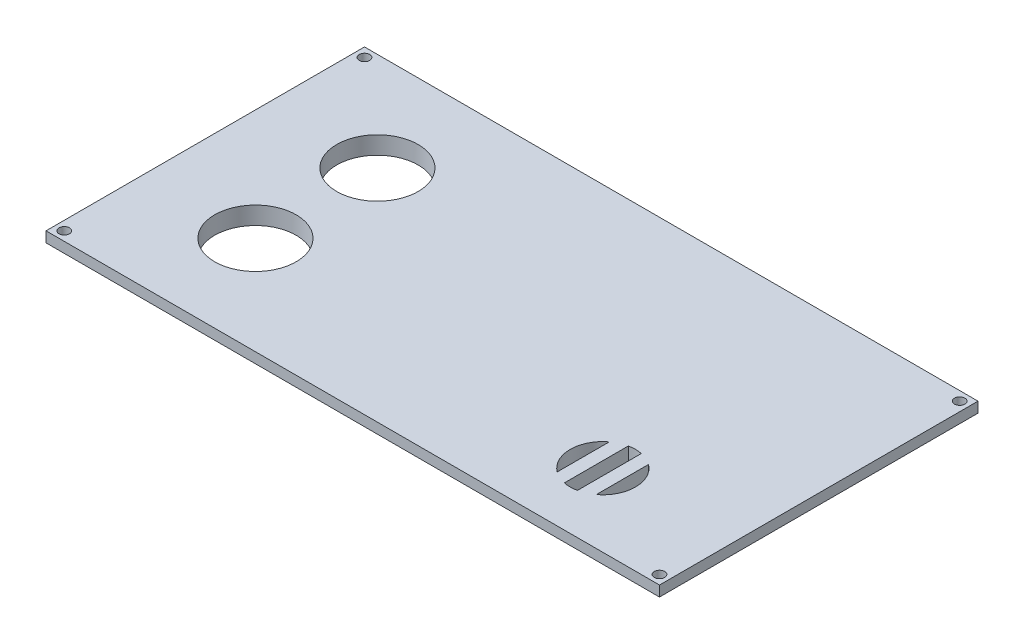
ISO-10303-21;
HEADER;
FILE_DESCRIPTION(('STEP AP214'),'2;1');
FILE_NAME('part.step','',(''),(''),'','','');
FILE_SCHEMA(('AUTOMOTIVE_DESIGN { 1 0 10303 214 1 1 1 1 }'));
ENDSEC;
DATA;
#1=APPLICATION_CONTEXT('core data for automotive mechanical design processes');
#2=APPLICATION_PROTOCOL_DEFINITION('international standard','automotive_design',2000,#1);
#3=PRODUCT_CONTEXT('',#1,'mechanical');
#4=PRODUCT('Part','Part','',(#3));
#5=PRODUCT_RELATED_PRODUCT_CATEGORY('part','',(#4));
#6=PRODUCT_DEFINITION_FORMATION('','',#4);
#7=PRODUCT_DEFINITION_CONTEXT('part definition',#1,'design');
#8=PRODUCT_DEFINITION('design','',#6,#7);
#9=PRODUCT_DEFINITION_SHAPE('','',#8);
#10=(LENGTH_UNIT() NAMED_UNIT(*) SI_UNIT(.MILLI.,.METRE.));
#11=(NAMED_UNIT(*) PLANE_ANGLE_UNIT() SI_UNIT($,.RADIAN.));
#12=(NAMED_UNIT(*) SI_UNIT($,.STERADIAN.) SOLID_ANGLE_UNIT());
#13=UNCERTAINTY_MEASURE_WITH_UNIT(LENGTH_MEASURE(1.E-05),#10,'distance_accuracy_value','');
#14=(GEOMETRIC_REPRESENTATION_CONTEXT(3) GLOBAL_UNCERTAINTY_ASSIGNED_CONTEXT((#13)) GLOBAL_UNIT_ASSIGNED_CONTEXT((#10,
#11,#12)) REPRESENTATION_CONTEXT('',''));
#15=CARTESIAN_POINT('',(0.,0.,0.));
#16=DIRECTION('',(0.,0.,1.));
#17=DIRECTION('',(1.,0.,0.));
#18=AXIS2_PLACEMENT_3D('',#15,#16,#17);
#19=CARTESIAN_POINT('',(0.,0.,0.));
#20=DIRECTION('',(0.,1.,0.));
#21=DIRECTION('',(0.,0.,1.));
#22=AXIS2_PLACEMENT_3D('',#19,#20,#21);
#23=PLANE('',#22);
#24=CARTESIAN_POINT('',(54.6975267144959,0.,16.55));
#25=DIRECTION('',(0.,1.,0.));
#26=DIRECTION('',(0.,0.,1.));
#27=AXIS2_PLACEMENT_3D('',#24,#25,#26);
#28=CIRCLE('',#27,6.25);
#29=CARTESIAN_POINT('',(53.4475267144959,0.,22.673724356958));
#30=VERTEX_POINT('',#29);
#31=CARTESIAN_POINT('',(55.9475267144959,0.,22.673724356958));
#32=VERTEX_POINT('',#31);
#33=EDGE_CURVE('E59',#30,#32,#28,.T.);
#34=ORIENTED_EDGE('',*,*,#33,.T.);
#35=DIRECTION('',(0.,0.,-1.));
#36=VECTOR('',#35,1.);
#37=CARTESIAN_POINT('',(55.9475267144959,0.,10.4262756430421));
#38=LINE('',#37,#36);
#39=CARTESIAN_POINT('',(55.9475267144959,0.,10.4262756430421));
#40=VERTEX_POINT('',#39);
#41=EDGE_CURVE('E185',#32,#40,#38,.T.);
#42=ORIENTED_EDGE('',*,*,#41,.T.);
#43=CARTESIAN_POINT('',(54.6975267144959,0.,16.55));
#44=DIRECTION('',(0.,1.,0.));
#45=DIRECTION('',(0.,0.,1.));
#46=AXIS2_PLACEMENT_3D('',#43,#44,#45);
#47=CIRCLE('',#46,6.25);
#48=CARTESIAN_POINT('',(53.4475267144959,0.,10.4262756430421));
#49=VERTEX_POINT('',#48);
#50=EDGE_CURVE('E189',#40,#49,#47,.T.);
#51=ORIENTED_EDGE('',*,*,#50,.T.);
#52=DIRECTION('',(0.,0.,1.));
#53=VECTOR('',#52,1.);
#54=CARTESIAN_POINT('',(53.4475267144959,0.,10.4262756430421));
#55=LINE('',#54,#53);
#56=EDGE_CURVE('E176',#49,#30,#55,.T.);
#57=ORIENTED_EDGE('',*,*,#56,.T.);
#58=EDGE_LOOP('',(#34,#42,#51,#57));
#59=FACE_BOUND('',#58,.T.);
#60=DIRECTION('',(0.,0.,1.));
#61=VECTOR('',#60,1.);
#62=CARTESIAN_POINT('',(-35.0024732855041,0.,27.25));
#63=LINE('',#62,#61);
#64=CARTESIAN_POINT('',(-35.0024732855041,0.,-27.25));
#65=VERTEX_POINT('',#64);
#66=CARTESIAN_POINT('',(-35.0024732855041,0.,27.25));
#67=VERTEX_POINT('',#66);
#68=EDGE_CURVE('E276',#65,#67,#63,.T.);
#69=ORIENTED_EDGE('',*,*,#68,.F.);
#70=DIRECTION('',(-1.,0.,0.));
#71=VECTOR('',#70,1.);
#72=CARTESIAN_POINT('',(76.4975267144959,0.,-27.25));
#73=LINE('',#72,#71);
#74=CARTESIAN_POINT('',(76.4975267144959,0.,-27.25));
#75=VERTEX_POINT('',#74);
#76=EDGE_CURVE('E281',#75,#65,#73,.T.);
#77=ORIENTED_EDGE('',*,*,#76,.F.);
#78=DIRECTION('',(0.,0.,-1.));
#79=VECTOR('',#78,1.);
#80=CARTESIAN_POINT('',(76.4975267144959,0.,27.25));
#81=LINE('',#80,#79);
#82=CARTESIAN_POINT('',(76.4975267144959,0.,27.25));
#83=VERTEX_POINT('',#82);
#84=EDGE_CURVE('E295',#83,#75,#81,.T.);
#85=ORIENTED_EDGE('',*,*,#84,.F.);
#86=DIRECTION('',(1.,0.,0.));
#87=VECTOR('',#86,1.);
#88=CARTESIAN_POINT('',(76.4975267144959,0.,27.25));
#89=LINE('',#88,#87);
#90=EDGE_CURVE('E293',#67,#83,#89,.T.);
#91=ORIENTED_EDGE('',*,*,#90,.F.);
#92=EDGE_LOOP('',(#69,#77,#85,#91));
#93=FACE_BOUND('',#92,.T.);
#94=CARTESIAN_POINT('',(-16.7103307869495,-6.72205346941013E-13,11.6806697687176));
#95=DIRECTION('',(0.,1.,0.));
#96=DIRECTION('',(-1.,0.,0.));
#97=AXIS2_PLACEMENT_3D('',#94,#95,#96);
#98=CIRCLE('',#97,7.8);
#99=CARTESIAN_POINT('',(-24.5103307869496,-7.26693668450394E-13,11.6806697687176));
#100=VERTEX_POINT('',#99);
#101=EDGE_CURVE('E172',#100,#100,#98,.T.);
#102=ORIENTED_EDGE('',*,*,#101,.T.);
#103=EDGE_LOOP('',(#102));
#104=FACE_BOUND('',#103,.T.);
#105=CARTESIAN_POINT('',(-16.6829397420246,-6.71337985203024E-13,-11.6611086723038));
#106=DIRECTION('',(0.,1.,0.));
#107=DIRECTION('',(-1.,0.,0.));
#108=AXIS2_PLACEMENT_3D('',#105,#106,#107);
#109=CIRCLE('',#108,7.8);
#110=CARTESIAN_POINT('',(-24.4829397420246,-7.25826306712406E-13,-11.6611086723038));
#111=VERTEX_POINT('',#110);
#112=EDGE_CURVE('E216',#111,#111,#109,.T.);
#113=ORIENTED_EDGE('',*,*,#112,.T.);
#114=EDGE_LOOP('',(#113));
#115=FACE_BOUND('',#114,.T.);
#116=CARTESIAN_POINT('',(54.6975267144959,0.,16.55));
#117=DIRECTION('',(0.,1.,0.));
#118=DIRECTION('',(0.,0.,1.));
#119=AXIS2_PLACEMENT_3D('',#116,#117,#118);
#120=CIRCLE('',#119,6.25);
#121=CARTESIAN_POINT('',(58.4475267144959,0.,21.55));
#122=VERTEX_POINT('',#121);
#123=CARTESIAN_POINT('',(58.4475267144959,0.,11.55));
#124=VERTEX_POINT('',#123);
#125=EDGE_CURVE('E207',#122,#124,#120,.T.);
#126=ORIENTED_EDGE('',*,*,#125,.T.);
#127=DIRECTION('',(0.,0.,1.));
#128=VECTOR('',#127,1.);
#129=CARTESIAN_POINT('',(58.4475267144959,0.,11.55));
#130=LINE('',#129,#128);
#131=EDGE_CURVE('E204',#124,#122,#130,.T.);
#132=ORIENTED_EDGE('',*,*,#131,.T.);
#133=EDGE_LOOP('',(#126,#132));
#134=FACE_BOUND('',#133,.T.);
#135=CARTESIAN_POINT('',(54.6975267144959,0.,16.55));
#136=DIRECTION('',(0.,1.,0.));
#137=DIRECTION('',(0.,0.,1.));
#138=AXIS2_PLACEMENT_3D('',#135,#136,#137);
#139=CIRCLE('',#138,6.25);
#140=CARTESIAN_POINT('',(50.9475267144959,0.,11.55));
#141=VERTEX_POINT('',#140);
#142=CARTESIAN_POINT('',(50.9475267144959,0.,21.55));
#143=VERTEX_POINT('',#142);
#144=EDGE_CURVE('E51',#141,#143,#139,.T.);
#145=ORIENTED_EDGE('',*,*,#144,.T.);
#146=DIRECTION('',(0.,0.,-1.));
#147=VECTOR('',#146,1.);
#148=CARTESIAN_POINT('',(50.9475267144959,0.,11.55));
#149=LINE('',#148,#147);
#150=EDGE_CURVE('E165',#143,#141,#149,.T.);
#151=ORIENTED_EDGE('',*,*,#150,.T.);
#152=EDGE_LOOP('',(#145,#151));
#153=FACE_BOUND('',#152,.T.);
#154=ADVANCED_FACE('F34',(#59,#93,#104,#115,#134,#153),#23,.F.);
#155=CARTESIAN_POINT('',(0.,3.4,0.));
#156=DIRECTION('',(0.,1.,0.));
#157=DIRECTION('',(0.,0.,1.));
#158=AXIS2_PLACEMENT_3D('',#155,#156,#157);
#159=PLANE('',#158);
#160=CARTESIAN_POINT('',(-16.6829397420246,3.4,-11.6611086723038));
#161=DIRECTION('',(0.,1.,0.));
#162=DIRECTION('',(0.,0.,1.));
#163=AXIS2_PLACEMENT_3D('',#160,#161,#162);
#164=CIRCLE('',#163,7.8);
#165=CARTESIAN_POINT('',(-16.6829397420246,3.4,-3.8611086723038));
#166=VERTEX_POINT('',#165);
#167=EDGE_CURVE('E38',#166,#166,#164,.T.);
#168=ORIENTED_EDGE('',*,*,#167,.F.);
#169=EDGE_LOOP('',(#168));
#170=FACE_BOUND('',#169,.T.);
#171=CARTESIAN_POINT('',(-16.7103307869496,3.4,11.6806697687176));
#172=DIRECTION('',(0.,1.,0.));
#173=DIRECTION('',(0.,0.,1.));
#174=AXIS2_PLACEMENT_3D('',#171,#172,#173);
#175=CIRCLE('',#174,7.8);
#176=CARTESIAN_POINT('',(-16.7103307869496,3.4,19.4806697687176));
#177=VERTEX_POINT('',#176);
#178=EDGE_CURVE('E219',#177,#177,#175,.T.);
#179=ORIENTED_EDGE('',*,*,#178,.F.);
#180=EDGE_LOOP('',(#179));
#181=FACE_BOUND('',#180,.T.);
#182=CARTESIAN_POINT('',(-36.25,3.4,28.75));
#183=DIRECTION('',(0.,1.,0.));
#184=DIRECTION('',(0.,0.,1.));
#185=AXIS2_PLACEMENT_3D('',#182,#183,#184);
#186=CIRCLE('',#185,0.999999999999998);
#187=CARTESIAN_POINT('',(-36.25,3.4,29.75));
#188=VERTEX_POINT('',#187);
#189=EDGE_CURVE('E229',#188,#188,#186,.T.);
#190=ORIENTED_EDGE('',*,*,#189,.F.);
#191=EDGE_LOOP('',(#190));
#192=FACE_BOUND('',#191,.T.);
#193=CARTESIAN_POINT('',(77.7475267144959,3.4,28.75));
#194=DIRECTION('',(0.,1.,0.));
#195=DIRECTION('',(0.,0.,1.));
#196=AXIS2_PLACEMENT_3D('',#193,#194,#195);
#197=CIRCLE('',#196,0.999999999999998);
#198=CARTESIAN_POINT('',(77.7475267144959,3.4,29.75));
#199=VERTEX_POINT('',#198);
#200=EDGE_CURVE('E226',#199,#199,#197,.T.);
#201=ORIENTED_EDGE('',*,*,#200,.F.);
#202=EDGE_LOOP('',(#201));
#203=FACE_BOUND('',#202,.T.);
#204=CARTESIAN_POINT('',(77.7475267144959,3.4,-28.75));
#205=DIRECTION('',(0.,1.,0.));
#206=DIRECTION('',(0.,0.,1.));
#207=AXIS2_PLACEMENT_3D('',#204,#205,#206);
#208=CIRCLE('',#207,0.999999999999998);
#209=CARTESIAN_POINT('',(77.7475267144959,3.4,-27.75));
#210=VERTEX_POINT('',#209);
#211=EDGE_CURVE('E222',#210,#210,#208,.T.);
#212=ORIENTED_EDGE('',*,*,#211,.F.);
#213=EDGE_LOOP('',(#212));
#214=FACE_BOUND('',#213,.T.);
#215=CARTESIAN_POINT('',(-36.2524732855041,3.4,-28.75));
#216=DIRECTION('',(0.,1.,0.));
#217=DIRECTION('',(0.,0.,1.));
#218=AXIS2_PLACEMENT_3D('',#215,#216,#217);
#219=CIRCLE('',#218,0.999999999999998);
#220=CARTESIAN_POINT('',(-36.2524732855041,3.4,-27.75));
#221=VERTEX_POINT('',#220);
#222=EDGE_CURVE('E225',#221,#221,#219,.T.);
#223=ORIENTED_EDGE('',*,*,#222,.F.);
#224=EDGE_LOOP('',(#223));
#225=FACE_BOUND('',#224,.T.);
#226=DIRECTION('',(0.,0.,1.));
#227=VECTOR('',#226,1.);
#228=CARTESIAN_POINT('',(-38.0024732855041,3.4,30.5));
#229=LINE('',#228,#227);
#230=CARTESIAN_POINT('',(-38.0024732855041,3.4,-30.5));
#231=VERTEX_POINT('',#230);
#232=CARTESIAN_POINT('',(-38.0024732855041,3.4,30.5));
#233=VERTEX_POINT('',#232);
#234=EDGE_CURVE('E247',#231,#233,#229,.T.);
#235=ORIENTED_EDGE('',*,*,#234,.T.);
#236=DIRECTION('',(1.,0.,0.));
#237=VECTOR('',#236,1.);
#238=CARTESIAN_POINT('',(79.4975267144959,3.4,30.5));
#239=LINE('',#238,#237);
#240=CARTESIAN_POINT('',(79.4975267144959,3.4,30.5));
#241=VERTEX_POINT('',#240);
#242=EDGE_CURVE('E250',#233,#241,#239,.T.);
#243=ORIENTED_EDGE('',*,*,#242,.T.);
#244=DIRECTION('',(0.,0.,-1.));
#245=VECTOR('',#244,1.);
#246=CARTESIAN_POINT('',(79.4975267144959,3.4,30.5));
#247=LINE('',#246,#245);
#248=CARTESIAN_POINT('',(79.4975267144959,3.4,-30.5));
#249=VERTEX_POINT('',#248);
#250=EDGE_CURVE('E253',#241,#249,#247,.T.);
#251=ORIENTED_EDGE('',*,*,#250,.T.);
#252=DIRECTION('',(-1.,0.,0.));
#253=VECTOR('',#252,1.);
#254=CARTESIAN_POINT('',(79.4975267144959,3.4,-30.5));
#255=LINE('',#254,#253);
#256=EDGE_CURVE('E255',#249,#231,#255,.T.);
#257=ORIENTED_EDGE('',*,*,#256,.T.);
#258=EDGE_LOOP('',(#235,#243,#251,#257));
#259=FACE_BOUND('',#258,.T.);
#260=DIRECTION('',(0.,0.,1.));
#261=VECTOR('',#260,1.);
#262=CARTESIAN_POINT('',(58.4475267144959,3.4,11.55));
#263=LINE('',#262,#261);
#264=CARTESIAN_POINT('',(58.4475267144959,3.4,11.55));
#265=VERTEX_POINT('',#264);
#266=CARTESIAN_POINT('',(58.4475267144959,3.4,21.55));
#267=VERTEX_POINT('',#266);
#268=EDGE_CURVE('E203',#265,#267,#263,.T.);
#269=ORIENTED_EDGE('',*,*,#268,.F.);
#270=CARTESIAN_POINT('',(54.6975267144959,3.4,16.55));
#271=DIRECTION('',(0.,1.,0.));
#272=DIRECTION('',(0.,0.,1.));
#273=AXIS2_PLACEMENT_3D('',#270,#271,#272);
#274=CIRCLE('',#273,6.25);
#275=EDGE_CURVE('E200',#267,#265,#274,.T.);
#276=ORIENTED_EDGE('',*,*,#275,.F.);
#277=EDGE_LOOP('',(#269,#276));
#278=FACE_BOUND('',#277,.T.);
#279=DIRECTION('',(0.,0.,-1.));
#280=VECTOR('',#279,1.);
#281=CARTESIAN_POINT('',(55.9475267144959,3.4,10.4262756430421));
#282=LINE('',#281,#280);
#283=CARTESIAN_POINT('',(55.9475267144959,3.4,22.673724356958));
#284=VERTEX_POINT('',#283);
#285=CARTESIAN_POINT('',(55.9475267144959,3.4,10.4262756430421));
#286=VERTEX_POINT('',#285);
#287=EDGE_CURVE('E175',#284,#286,#282,.T.);
#288=ORIENTED_EDGE('',*,*,#287,.F.);
#289=CARTESIAN_POINT('',(54.6975267144959,3.4,16.55));
#290=DIRECTION('',(0.,1.,0.));
#291=DIRECTION('',(0.,0.,1.));
#292=AXIS2_PLACEMENT_3D('',#289,#290,#291);
#293=CIRCLE('',#292,6.25);
#294=CARTESIAN_POINT('',(53.4475267144959,3.4,22.673724356958));
#295=VERTEX_POINT('',#294);
#296=EDGE_CURVE('E173',#295,#284,#293,.T.);
#297=ORIENTED_EDGE('',*,*,#296,.F.);
#298=DIRECTION('',(0.,0.,1.));
#299=VECTOR('',#298,1.);
#300=CARTESIAN_POINT('',(53.4475267144959,3.4,10.4262756430421));
#301=LINE('',#300,#299);
#302=CARTESIAN_POINT('',(53.4475267144959,3.4,10.4262756430421));
#303=VERTEX_POINT('',#302);
#304=EDGE_CURVE('E181',#303,#295,#301,.T.);
#305=ORIENTED_EDGE('',*,*,#304,.F.);
#306=CARTESIAN_POINT('',(54.6975267144959,3.4,16.55));
#307=DIRECTION('',(0.,1.,0.));
#308=DIRECTION('',(0.,0.,1.));
#309=AXIS2_PLACEMENT_3D('',#306,#307,#308);
#310=CIRCLE('',#309,6.25);
#311=EDGE_CURVE('E178',#286,#303,#310,.T.);
#312=ORIENTED_EDGE('',*,*,#311,.F.);
#313=EDGE_LOOP('',(#288,#297,#305,#312));
#314=FACE_BOUND('',#313,.T.);
#315=DIRECTION('',(0.,0.,-1.));
#316=VECTOR('',#315,1.);
#317=CARTESIAN_POINT('',(50.9475267144959,3.4,11.55));
#318=LINE('',#317,#316);
#319=CARTESIAN_POINT('',(50.9475267144959,3.4,21.55));
#320=VERTEX_POINT('',#319);
#321=CARTESIAN_POINT('',(50.9475267144959,3.4,11.55));
#322=VERTEX_POINT('',#321);
#323=EDGE_CURVE('E152',#320,#322,#318,.T.);
#324=ORIENTED_EDGE('',*,*,#323,.F.);
#325=CARTESIAN_POINT('',(54.6975267144959,3.4,16.55));
#326=DIRECTION('',(0.,1.,0.));
#327=DIRECTION('',(0.,0.,1.));
#328=AXIS2_PLACEMENT_3D('',#325,#326,#327);
#329=CIRCLE('',#328,6.25);
#330=EDGE_CURVE('E160',#322,#320,#329,.T.);
#331=ORIENTED_EDGE('',*,*,#330,.F.);
#332=EDGE_LOOP('',(#324,#331));
#333=FACE_BOUND('',#332,.T.);
#334=ADVANCED_FACE('F164',(#170,#181,#192,#203,#214,#225,#259,#278,#314,#333),#159,.T.);
#335=CARTESIAN_POINT('',(-35.0024732855041,1.4,27.25));
#336=DIRECTION('',(1.,0.,0.));
#337=DIRECTION('',(0.,0.,-1.));
#338=AXIS2_PLACEMENT_3D('',#335,#336,#337);
#339=PLANE('',#338);
#340=ORIENTED_EDGE('',*,*,#68,.T.);
#341=DIRECTION('',(0.,-1.,0.));
#342=VECTOR('',#341,1.);
#343=CARTESIAN_POINT('',(-35.0024732855041,1.4,27.25));
#344=LINE('',#343,#342);
#345=CARTESIAN_POINT('',(-35.0024732855041,1.4,27.25));
#346=VERTEX_POINT('',#345);
#347=EDGE_CURVE('E11',#346,#67,#344,.T.);
#348=ORIENTED_EDGE('',*,*,#347,.F.);
#349=DIRECTION('',(0.,0.,1.));
#350=VECTOR('',#349,1.);
#351=CARTESIAN_POINT('',(-35.0024732855041,1.4,27.25));
#352=LINE('',#351,#350);
#353=CARTESIAN_POINT('',(-35.0024732855041,1.4,-27.25));
#354=VERTEX_POINT('',#353);
#355=EDGE_CURVE('E277',#354,#346,#352,.T.);
#356=ORIENTED_EDGE('',*,*,#355,.F.);
#357=DIRECTION('',(0.,-1.,0.));
#358=VECTOR('',#357,1.);
#359=CARTESIAN_POINT('',(-35.0024732855041,1.4,-27.25));
#360=LINE('',#359,#358);
#361=EDGE_CURVE('E290',#354,#65,#360,.T.);
#362=ORIENTED_EDGE('',*,*,#361,.T.);
#363=EDGE_LOOP('',(#340,#348,#356,#362));
#364=FACE_BOUND('',#363,.T.);
#365=ADVANCED_FACE('F36',(#364),#339,.F.);
#366=CARTESIAN_POINT('',(76.4975267144959,1.4,27.25));
#367=DIRECTION('',(0.,0.,-1.));
#368=DIRECTION('',(-1.,0.,0.));
#369=AXIS2_PLACEMENT_3D('',#366,#367,#368);
#370=PLANE('',#369);
#371=ORIENTED_EDGE('',*,*,#90,.T.);
#372=DIRECTION('',(0.,-1.,0.));
#373=VECTOR('',#372,1.);
#374=CARTESIAN_POINT('',(76.4975267144959,1.4,27.25));
#375=LINE('',#374,#373);
#376=CARTESIAN_POINT('',(76.4975267144959,1.4,27.25));
#377=VERTEX_POINT('',#376);
#378=EDGE_CURVE('E43',#377,#83,#375,.T.);
#379=ORIENTED_EDGE('',*,*,#378,.F.);
#380=DIRECTION('',(1.,0.,0.));
#381=VECTOR('',#380,1.);
#382=CARTESIAN_POINT('',(76.4975267144959,1.4,27.25));
#383=LINE('',#382,#381);
#384=EDGE_CURVE('E280',#346,#377,#383,.T.);
#385=ORIENTED_EDGE('',*,*,#384,.F.);
#386=ORIENTED_EDGE('',*,*,#347,.T.);
#387=EDGE_LOOP('',(#371,#379,#385,#386));
#388=FACE_BOUND('',#387,.T.);
#389=ADVANCED_FACE('F371',(#388),#370,.F.);
#390=CARTESIAN_POINT('',(76.4975267144959,1.4,27.25));
#391=DIRECTION('',(-1.,0.,0.));
#392=DIRECTION('',(0.,0.,1.));
#393=AXIS2_PLACEMENT_3D('',#390,#391,#392);
#394=PLANE('',#393);
#395=ORIENTED_EDGE('',*,*,#84,.T.);
#396=DIRECTION('',(0.,-1.,0.));
#397=VECTOR('',#396,1.);
#398=CARTESIAN_POINT('',(76.4975267144959,1.4,-27.25));
#399=LINE('',#398,#397);
#400=CARTESIAN_POINT('',(76.4975267144959,1.4,-27.25));
#401=VERTEX_POINT('',#400);
#402=EDGE_CURVE('E300',#401,#75,#399,.T.);
#403=ORIENTED_EDGE('',*,*,#402,.F.);
#404=DIRECTION('',(0.,0.,-1.));
#405=VECTOR('',#404,1.);
#406=CARTESIAN_POINT('',(76.4975267144959,1.4,27.25));
#407=LINE('',#406,#405);
#408=EDGE_CURVE('E284',#377,#401,#407,.T.);
#409=ORIENTED_EDGE('',*,*,#408,.F.);
#410=ORIENTED_EDGE('',*,*,#378,.T.);
#411=EDGE_LOOP('',(#395,#403,#409,#410));
#412=FACE_BOUND('',#411,.T.);
#413=ADVANCED_FACE('F368',(#412),#394,.F.);
#414=CARTESIAN_POINT('',(76.4975267144959,1.4,-27.25));
#415=DIRECTION('',(0.,0.,1.));
#416=DIRECTION('',(1.,0.,0.));
#417=AXIS2_PLACEMENT_3D('',#414,#415,#416);
#418=PLANE('',#417);
#419=ORIENTED_EDGE('',*,*,#76,.T.);
#420=ORIENTED_EDGE('',*,*,#361,.F.);
#421=DIRECTION('',(-1.,0.,0.));
#422=VECTOR('',#421,1.);
#423=CARTESIAN_POINT('',(76.4975267144959,1.4,-27.25));
#424=LINE('',#423,#422);
#425=EDGE_CURVE('E287',#401,#354,#424,.T.);
#426=ORIENTED_EDGE('',*,*,#425,.F.);
#427=ORIENTED_EDGE('',*,*,#402,.T.);
#428=EDGE_LOOP('',(#419,#420,#426,#427));
#429=FACE_BOUND('',#428,.T.);
#430=ADVANCED_FACE('F364',(#429),#418,.F.);
#431=CARTESIAN_POINT('',(0.,1.4,0.));
#432=DIRECTION('',(0.,1.,0.));
#433=DIRECTION('',(0.,0.,1.));
#434=AXIS2_PLACEMENT_3D('',#431,#432,#433);
#435=PLANE('',#434);
#436=CARTESIAN_POINT('',(-36.25,1.4,28.75));
#437=DIRECTION('',(0.,1.,0.));
#438=DIRECTION('',(0.,0.,1.));
#439=AXIS2_PLACEMENT_3D('',#436,#437,#438);
#440=CIRCLE('',#439,0.999999999999998);
#441=CARTESIAN_POINT('',(-36.25,1.4,29.75));
#442=VERTEX_POINT('',#441);
#443=EDGE_CURVE('E243',#442,#442,#440,.T.);
#444=ORIENTED_EDGE('',*,*,#443,.T.);
#445=EDGE_LOOP('',(#444));
#446=FACE_BOUND('',#445,.T.);
#447=CARTESIAN_POINT('',(77.7475267144959,1.4,28.75));
#448=DIRECTION('',(0.,1.,0.));
#449=DIRECTION('',(0.,0.,1.));
#450=AXIS2_PLACEMENT_3D('',#447,#448,#449);
#451=CIRCLE('',#450,0.999999999999998);
#452=CARTESIAN_POINT('',(77.7475267144959,1.4,29.75));
#453=VERTEX_POINT('',#452);
#454=EDGE_CURVE('E240',#453,#453,#451,.T.);
#455=ORIENTED_EDGE('',*,*,#454,.T.);
#456=EDGE_LOOP('',(#455));
#457=FACE_BOUND('',#456,.T.);
#458=CARTESIAN_POINT('',(77.7475267144959,1.4,-28.75));
#459=DIRECTION('',(0.,1.,0.));
#460=DIRECTION('',(0.,0.,1.));
#461=AXIS2_PLACEMENT_3D('',#458,#459,#460);
#462=CIRCLE('',#461,0.999999999999998);
#463=CARTESIAN_POINT('',(77.7475267144959,1.4,-27.75));
#464=VERTEX_POINT('',#463);
#465=EDGE_CURVE('E237',#464,#464,#462,.T.);
#466=ORIENTED_EDGE('',*,*,#465,.T.);
#467=EDGE_LOOP('',(#466));
#468=FACE_BOUND('',#467,.T.);
#469=CARTESIAN_POINT('',(-36.2524732855041,1.4,-28.75));
#470=DIRECTION('',(0.,1.,0.));
#471=DIRECTION('',(0.,0.,1.));
#472=AXIS2_PLACEMENT_3D('',#469,#470,#471);
#473=CIRCLE('',#472,0.999999999999998);
#474=CARTESIAN_POINT('',(-36.2524732855041,1.4,-27.75));
#475=VERTEX_POINT('',#474);
#476=EDGE_CURVE('E234',#475,#475,#473,.T.);
#477=ORIENTED_EDGE('',*,*,#476,.T.);
#478=EDGE_LOOP('',(#477));
#479=FACE_BOUND('',#478,.T.);
#480=DIRECTION('',(0.,0.,1.));
#481=VECTOR('',#480,1.);
#482=CARTESIAN_POINT('',(-38.0024732855041,1.4,30.5));
#483=LINE('',#482,#481);
#484=CARTESIAN_POINT('',(-38.0024732855041,1.4,-30.5));
#485=VERTEX_POINT('',#484);
#486=CARTESIAN_POINT('',(-38.0024732855041,1.4,30.5));
#487=VERTEX_POINT('',#486);
#488=EDGE_CURVE('E246',#485,#487,#483,.T.);
#489=ORIENTED_EDGE('',*,*,#488,.F.);
#490=DIRECTION('',(-1.,0.,0.));
#491=VECTOR('',#490,1.);
#492=CARTESIAN_POINT('',(79.4975267144959,1.4,-30.5));
#493=LINE('',#492,#491);
#494=CARTESIAN_POINT('',(79.4975267144959,1.4,-30.5));
#495=VERTEX_POINT('',#494);
#496=EDGE_CURVE('E251',#495,#485,#493,.T.);
#497=ORIENTED_EDGE('',*,*,#496,.F.);
#498=DIRECTION('',(0.,0.,-1.));
#499=VECTOR('',#498,1.);
#500=CARTESIAN_POINT('',(79.4975267144959,1.4,30.5));
#501=LINE('',#500,#499);
#502=CARTESIAN_POINT('',(79.4975267144959,1.4,30.5));
#503=VERTEX_POINT('',#502);
#504=EDGE_CURVE('E262',#503,#495,#501,.T.);
#505=ORIENTED_EDGE('',*,*,#504,.F.);
#506=DIRECTION('',(1.,0.,0.));
#507=VECTOR('',#506,1.);
#508=CARTESIAN_POINT('',(79.4975267144959,1.4,30.5));
#509=LINE('',#508,#507);
#510=EDGE_CURVE('E260',#487,#503,#509,.T.);
#511=ORIENTED_EDGE('',*,*,#510,.F.);
#512=EDGE_LOOP('',(#489,#497,#505,#511));
#513=FACE_BOUND('',#512,.T.);
#514=ORIENTED_EDGE('',*,*,#425,.T.);
#515=ORIENTED_EDGE('',*,*,#355,.T.);
#516=ORIENTED_EDGE('',*,*,#384,.T.);
#517=ORIENTED_EDGE('',*,*,#408,.T.);
#518=EDGE_LOOP('',(#514,#515,#516,#517));
#519=FACE_BOUND('',#518,.T.);
#520=ADVANCED_FACE('F367',(#446,#457,#468,#479,#513,#519),#435,.F.);
#521=CARTESIAN_POINT('',(-38.0024732855041,3.4,30.5));
#522=DIRECTION('',(1.,0.,0.));
#523=DIRECTION('',(0.,0.,-1.));
#524=AXIS2_PLACEMENT_3D('',#521,#522,#523);
#525=PLANE('',#524);
#526=ORIENTED_EDGE('',*,*,#488,.T.);
#527=DIRECTION('',(0.,-1.,0.));
#528=VECTOR('',#527,1.);
#529=CARTESIAN_POINT('',(-38.0024732855041,3.4,30.5));
#530=LINE('',#529,#528);
#531=EDGE_CURVE('E273',#233,#487,#530,.T.);
#532=ORIENTED_EDGE('',*,*,#531,.F.);
#533=ORIENTED_EDGE('',*,*,#234,.F.);
#534=DIRECTION('',(0.,-1.,0.));
#535=VECTOR('',#534,1.);
#536=CARTESIAN_POINT('',(-38.0024732855041,3.4,-30.5));
#537=LINE('',#536,#535);
#538=EDGE_CURVE('E257',#231,#485,#537,.T.);
#539=ORIENTED_EDGE('',*,*,#538,.T.);
#540=EDGE_LOOP('',(#526,#532,#533,#539));
#541=FACE_BOUND('',#540,.T.);
#542=ADVANCED_FACE('F362',(#541),#525,.F.);
#543=CARTESIAN_POINT('',(79.4975267144959,3.4,30.5));
#544=DIRECTION('',(0.,0.,-1.));
#545=DIRECTION('',(-1.,0.,0.));
#546=AXIS2_PLACEMENT_3D('',#543,#544,#545);
#547=PLANE('',#546);
#548=ORIENTED_EDGE('',*,*,#510,.T.);
#549=DIRECTION('',(0.,-1.,0.));
#550=VECTOR('',#549,1.);
#551=CARTESIAN_POINT('',(79.4975267144959,3.4,30.5));
#552=LINE('',#551,#550);
#553=EDGE_CURVE('E270',#241,#503,#552,.T.);
#554=ORIENTED_EDGE('',*,*,#553,.F.);
#555=ORIENTED_EDGE('',*,*,#242,.F.);
#556=ORIENTED_EDGE('',*,*,#531,.T.);
#557=EDGE_LOOP('',(#548,#554,#555,#556));
#558=FACE_BOUND('',#557,.T.);
#559=ADVANCED_FACE('F394',(#558),#547,.F.);
#560=CARTESIAN_POINT('',(79.4975267144959,3.4,30.5));
#561=DIRECTION('',(-1.,0.,0.));
#562=DIRECTION('',(0.,0.,1.));
#563=AXIS2_PLACEMENT_3D('',#560,#561,#562);
#564=PLANE('',#563);
#565=ORIENTED_EDGE('',*,*,#504,.T.);
#566=DIRECTION('',(0.,-1.,0.));
#567=VECTOR('',#566,1.);
#568=CARTESIAN_POINT('',(79.4975267144959,3.4,-30.5));
#569=LINE('',#568,#567);
#570=EDGE_CURVE('E267',#249,#495,#569,.T.);
#571=ORIENTED_EDGE('',*,*,#570,.F.);
#572=ORIENTED_EDGE('',*,*,#250,.F.);
#573=ORIENTED_EDGE('',*,*,#553,.T.);
#574=EDGE_LOOP('',(#565,#571,#572,#573));
#575=FACE_BOUND('',#574,.T.);
#576=ADVANCED_FACE('F403',(#575),#564,.F.);
#577=CARTESIAN_POINT('',(79.4975267144959,3.4,-30.5));
#578=DIRECTION('',(0.,0.,1.));
#579=DIRECTION('',(1.,0.,0.));
#580=AXIS2_PLACEMENT_3D('',#577,#578,#579);
#581=PLANE('',#580);
#582=ORIENTED_EDGE('',*,*,#496,.T.);
#583=ORIENTED_EDGE('',*,*,#538,.F.);
#584=ORIENTED_EDGE('',*,*,#256,.F.);
#585=ORIENTED_EDGE('',*,*,#570,.T.);
#586=EDGE_LOOP('',(#582,#583,#584,#585));
#587=FACE_BOUND('',#586,.T.);
#588=ADVANCED_FACE('F399',(#587),#581,.F.);
#589=CARTESIAN_POINT('',(-36.2524732855041,0.,-28.75));
#590=DIRECTION('',(0.,1.,0.));
#591=DIRECTION('',(0.,0.,1.));
#592=AXIS2_PLACEMENT_3D('',#589,#590,#591);
#593=CYLINDRICAL_SURFACE('',#592,0.999999999999998);
#594=ORIENTED_EDGE('',*,*,#222,.T.);
#595=EDGE_LOOP('',(#594));
#596=FACE_BOUND('',#595,.T.);
#597=ORIENTED_EDGE('',*,*,#476,.F.);
#598=EDGE_LOOP('',(#597));
#599=FACE_BOUND('',#598,.T.);
#600=ADVANCED_FACE('F402',(#596,#599),#593,.F.);
#601=CARTESIAN_POINT('',(77.7475267144959,0.,-28.75));
#602=DIRECTION('',(0.,1.,0.));
#603=DIRECTION('',(0.,0.,1.));
#604=AXIS2_PLACEMENT_3D('',#601,#602,#603);
#605=CYLINDRICAL_SURFACE('',#604,0.999999999999998);
#606=ORIENTED_EDGE('',*,*,#211,.T.);
#607=EDGE_LOOP('',(#606));
#608=FACE_BOUND('',#607,.T.);
#609=ORIENTED_EDGE('',*,*,#465,.F.);
#610=EDGE_LOOP('',(#609));
#611=FACE_BOUND('',#610,.T.);
#612=ADVANCED_FACE('F436',(#608,#611),#605,.F.);
#613=CARTESIAN_POINT('',(77.7475267144959,0.,28.75));
#614=DIRECTION('',(0.,1.,0.));
#615=DIRECTION('',(0.,0.,1.));
#616=AXIS2_PLACEMENT_3D('',#613,#614,#615);
#617=CYLINDRICAL_SURFACE('',#616,0.999999999999998);
#618=ORIENTED_EDGE('',*,*,#200,.T.);
#619=EDGE_LOOP('',(#618));
#620=FACE_BOUND('',#619,.T.);
#621=ORIENTED_EDGE('',*,*,#454,.F.);
#622=EDGE_LOOP('',(#621));
#623=FACE_BOUND('',#622,.T.);
#624=ADVANCED_FACE('F443',(#620,#623),#617,.F.);
#625=CARTESIAN_POINT('',(-36.25,0.,28.75));
#626=DIRECTION('',(0.,1.,0.));
#627=DIRECTION('',(0.,0.,1.));
#628=AXIS2_PLACEMENT_3D('',#625,#626,#627);
#629=CYLINDRICAL_SURFACE('',#628,0.999999999999998);
#630=ORIENTED_EDGE('',*,*,#189,.T.);
#631=EDGE_LOOP('',(#630));
#632=FACE_BOUND('',#631,.T.);
#633=ORIENTED_EDGE('',*,*,#443,.F.);
#634=EDGE_LOOP('',(#633));
#635=FACE_BOUND('',#634,.T.);
#636=ADVANCED_FACE('F451',(#632,#635),#629,.F.);
#637=CARTESIAN_POINT('',(-16.7103307869495,-6.72205346941013E-13,11.6806697687176));
#638=DIRECTION('',(0.,1.,0.));
#639=DIRECTION('',(-1.,0.,0.));
#640=AXIS2_PLACEMENT_3D('',#637,#638,#639);
#641=CYLINDRICAL_SURFACE('',#640,7.8);
#642=ORIENTED_EDGE('',*,*,#178,.T.);
#643=EDGE_LOOP('',(#642));
#644=FACE_BOUND('',#643,.T.);
#645=ORIENTED_EDGE('',*,*,#101,.F.);
#646=EDGE_LOOP('',(#645));
#647=FACE_BOUND('',#646,.T.);
#648=ADVANCED_FACE('F459',(#644,#647),#641,.F.);
#649=CARTESIAN_POINT('',(-16.6829397420246,-6.71337985203024E-13,-11.6611086723038));
#650=DIRECTION('',(0.,1.,0.));
#651=DIRECTION('',(-1.,0.,0.));
#652=AXIS2_PLACEMENT_3D('',#649,#650,#651);
#653=CYLINDRICAL_SURFACE('',#652,7.8);
#654=ORIENTED_EDGE('',*,*,#167,.T.);
#655=EDGE_LOOP('',(#654));
#656=FACE_BOUND('',#655,.T.);
#657=ORIENTED_EDGE('',*,*,#112,.F.);
#658=EDGE_LOOP('',(#657));
#659=FACE_BOUND('',#658,.T.);
#660=ADVANCED_FACE('F310',(#656,#659),#653,.F.);
#661=CARTESIAN_POINT('',(54.6975267144959,3.4,16.55));
#662=DIRECTION('',(0.,-1.,0.));
#663=DIRECTION('',(0.,0.,-1.));
#664=AXIS2_PLACEMENT_3D('',#661,#662,#663);
#665=CYLINDRICAL_SURFACE('',#664,6.25);
#666=ORIENTED_EDGE('',*,*,#125,.F.);
#667=DIRECTION('',(0.,-1.,0.));
#668=VECTOR('',#667,1.);
#669=CARTESIAN_POINT('',(58.4475267144959,3.4,21.55));
#670=LINE('',#669,#668);
#671=EDGE_CURVE('E206',#267,#122,#670,.T.);
#672=ORIENTED_EDGE('',*,*,#671,.F.);
#673=ORIENTED_EDGE('',*,*,#275,.T.);
#674=DIRECTION('',(0.,-1.,0.));
#675=VECTOR('',#674,1.);
#676=CARTESIAN_POINT('',(58.4475267144959,3.4,11.55));
#677=LINE('',#676,#675);
#678=EDGE_CURVE('E186',#265,#124,#677,.T.);
#679=ORIENTED_EDGE('',*,*,#678,.T.);
#680=EDGE_LOOP('',(#666,#672,#673,#679));
#681=FACE_BOUND('',#680,.T.);
#682=ADVANCED_FACE('F473',(#681),#665,.F.);
#683=CARTESIAN_POINT('',(58.4475267144959,3.4,11.55));
#684=DIRECTION('',(1.,0.,0.));
#685=DIRECTION('',(0.,0.,-1.));
#686=AXIS2_PLACEMENT_3D('',#683,#684,#685);
#687=PLANE('',#686);
#688=ORIENTED_EDGE('',*,*,#131,.F.);
#689=ORIENTED_EDGE('',*,*,#678,.F.);
#690=ORIENTED_EDGE('',*,*,#268,.T.);
#691=ORIENTED_EDGE('',*,*,#671,.T.);
#692=EDGE_LOOP('',(#688,#689,#690,#691));
#693=FACE_BOUND('',#692,.T.);
#694=ADVANCED_FACE('F480',(#693),#687,.T.);
#695=CARTESIAN_POINT('',(54.6975267144959,3.4,16.55));
#696=DIRECTION('',(0.,-1.,0.));
#697=DIRECTION('',(0.,0.,-1.));
#698=AXIS2_PLACEMENT_3D('',#695,#696,#697);
#699=CYLINDRICAL_SURFACE('',#698,6.25);
#700=ORIENTED_EDGE('',*,*,#33,.F.);
#701=DIRECTION('',(0.,-1.,0.));
#702=VECTOR('',#701,1.);
#703=CARTESIAN_POINT('',(53.4475267144959,3.4,22.673724356958));
#704=LINE('',#703,#702);
#705=EDGE_CURVE('E183',#295,#30,#704,.T.);
#706=ORIENTED_EDGE('',*,*,#705,.F.);
#707=ORIENTED_EDGE('',*,*,#296,.T.);
#708=DIRECTION('',(0.,-1.,0.));
#709=VECTOR('',#708,1.);
#710=CARTESIAN_POINT('',(55.9475267144959,3.4,22.673724356958));
#711=LINE('',#710,#709);
#712=EDGE_CURVE('E169',#284,#32,#711,.T.);
#713=ORIENTED_EDGE('',*,*,#712,.T.);
#714=EDGE_LOOP('',(#700,#706,#707,#713));
#715=FACE_BOUND('',#714,.T.);
#716=ADVANCED_FACE('F345',(#715),#699,.F.);
#717=CARTESIAN_POINT('',(55.9475267144959,3.4,10.4262756430421));
#718=DIRECTION('',(-1.,0.,0.));
#719=DIRECTION('',(0.,0.,1.));
#720=AXIS2_PLACEMENT_3D('',#717,#718,#719);
#721=PLANE('',#720);
#722=ORIENTED_EDGE('',*,*,#41,.F.);
#723=ORIENTED_EDGE('',*,*,#712,.F.);
#724=ORIENTED_EDGE('',*,*,#287,.T.);
#725=DIRECTION('',(0.,-1.,0.));
#726=VECTOR('',#725,1.);
#727=CARTESIAN_POINT('',(55.9475267144959,3.4,10.4262756430421));
#728=LINE('',#727,#726);
#729=EDGE_CURVE('E197',#286,#40,#728,.T.);
#730=ORIENTED_EDGE('',*,*,#729,.T.);
#731=EDGE_LOOP('',(#722,#723,#724,#730));
#732=FACE_BOUND('',#731,.T.);
#733=ADVANCED_FACE('F338',(#732),#721,.T.);
#734=CARTESIAN_POINT('',(54.6975267144959,3.4,16.55));
#735=DIRECTION('',(0.,-1.,0.));
#736=DIRECTION('',(0.,0.,-1.));
#737=AXIS2_PLACEMENT_3D('',#734,#735,#736);
#738=CYLINDRICAL_SURFACE('',#737,6.25);
#739=ORIENTED_EDGE('',*,*,#50,.F.);
#740=ORIENTED_EDGE('',*,*,#729,.F.);
#741=ORIENTED_EDGE('',*,*,#311,.T.);
#742=DIRECTION('',(0.,-1.,0.));
#743=VECTOR('',#742,1.);
#744=CARTESIAN_POINT('',(53.4475267144959,3.4,10.4262756430421));
#745=LINE('',#744,#743);
#746=EDGE_CURVE('E195',#303,#49,#745,.T.);
#747=ORIENTED_EDGE('',*,*,#746,.T.);
#748=EDGE_LOOP('',(#739,#740,#741,#747));
#749=FACE_BOUND('',#748,.T.);
#750=ADVANCED_FACE('F341',(#749),#738,.F.);
#751=CARTESIAN_POINT('',(53.4475267144959,3.4,10.4262756430421));
#752=DIRECTION('',(1.,0.,0.));
#753=DIRECTION('',(0.,0.,-1.));
#754=AXIS2_PLACEMENT_3D('',#751,#752,#753);
#755=PLANE('',#754);
#756=ORIENTED_EDGE('',*,*,#56,.F.);
#757=ORIENTED_EDGE('',*,*,#746,.F.);
#758=ORIENTED_EDGE('',*,*,#304,.T.);
#759=ORIENTED_EDGE('',*,*,#705,.T.);
#760=EDGE_LOOP('',(#756,#757,#758,#759));
#761=FACE_BOUND('',#760,.T.);
#762=ADVANCED_FACE('F347',(#761),#755,.T.);
#763=CARTESIAN_POINT('',(54.6975267144959,3.4,16.55));
#764=DIRECTION('',(0.,-1.,0.));
#765=DIRECTION('',(0.,0.,-1.));
#766=AXIS2_PLACEMENT_3D('',#763,#764,#765);
#767=CYLINDRICAL_SURFACE('',#766,6.25);
#768=ORIENTED_EDGE('',*,*,#144,.F.);
#769=DIRECTION('',(0.,-1.,0.));
#770=VECTOR('',#769,1.);
#771=CARTESIAN_POINT('',(50.9475267144959,3.4,11.55));
#772=LINE('',#771,#770);
#773=EDGE_CURVE('E154',#322,#141,#772,.T.);
#774=ORIENTED_EDGE('',*,*,#773,.F.);
#775=ORIENTED_EDGE('',*,*,#330,.T.);
#776=DIRECTION('',(0.,-1.,0.));
#777=VECTOR('',#776,1.);
#778=CARTESIAN_POINT('',(50.9475267144959,3.4,21.55));
#779=LINE('',#778,#777);
#780=EDGE_CURVE('E156',#320,#143,#779,.T.);
#781=ORIENTED_EDGE('',*,*,#780,.T.);
#782=EDGE_LOOP('',(#768,#774,#775,#781));
#783=FACE_BOUND('',#782,.T.);
#784=ADVANCED_FACE('F162',(#783),#767,.F.);
#785=CARTESIAN_POINT('',(50.9475267144959,3.4,11.55));
#786=DIRECTION('',(-1.,0.,0.));
#787=DIRECTION('',(0.,0.,1.));
#788=AXIS2_PLACEMENT_3D('',#785,#786,#787);
#789=PLANE('',#788);
#790=ORIENTED_EDGE('',*,*,#150,.F.);
#791=ORIENTED_EDGE('',*,*,#780,.F.);
#792=ORIENTED_EDGE('',*,*,#323,.T.);
#793=ORIENTED_EDGE('',*,*,#773,.T.);
#794=EDGE_LOOP('',(#790,#791,#792,#793));
#795=FACE_BOUND('',#794,.T.);
#796=ADVANCED_FACE('F153',(#795),#789,.T.);
#797=CLOSED_SHELL('',(#154,#334,#365,#389,#413,#430,#520,#542,#559,#576,#588,#600,#612,#624,
#636,#648,#660,#682,#694,#716,#733,#750,#762,#784,#796));
#798=MANIFOLD_SOLID_BREP('B2',#797);
#799=ADVANCED_BREP_SHAPE_REPRESENTATION('',(#18,#798),#14);
#800=SHAPE_DEFINITION_REPRESENTATION(#9,#799);
ENDSEC;
END-ISO-10303-21;
